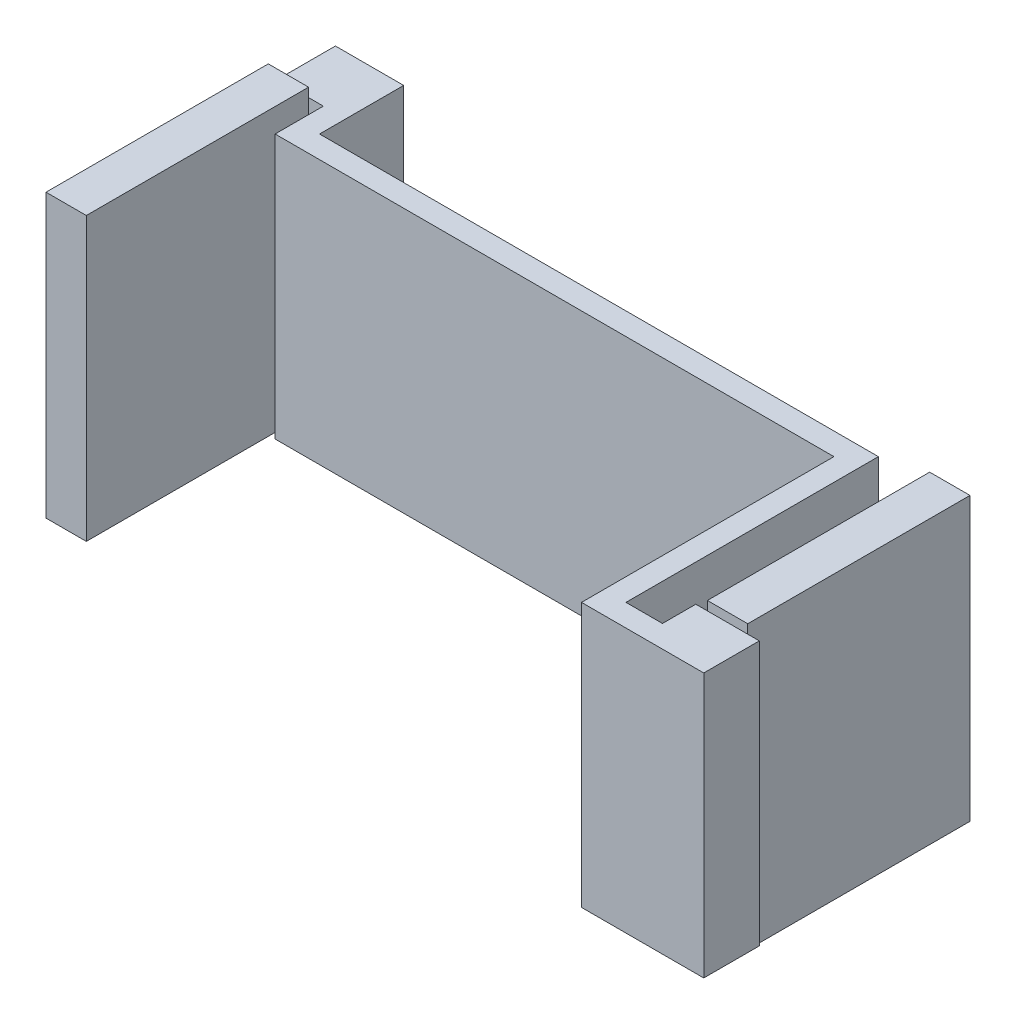
ISO-10303-21;
HEADER;
FILE_DESCRIPTION(('STEP AP214'),'2;1');
FILE_NAME('part.step','',(''),(''),'','','');
FILE_SCHEMA(('AUTOMOTIVE_DESIGN { 1 0 10303 214 1 1 1 1 }'));
ENDSEC;
DATA;
#1=APPLICATION_CONTEXT('core data for automotive mechanical design processes');
#2=APPLICATION_PROTOCOL_DEFINITION('international standard','automotive_design',2000,#1);
#3=PRODUCT_CONTEXT('',#1,'mechanical');
#4=PRODUCT('Part','Part','',(#3));
#5=PRODUCT_RELATED_PRODUCT_CATEGORY('part','',(#4));
#6=PRODUCT_DEFINITION_FORMATION('','',#4);
#7=PRODUCT_DEFINITION_CONTEXT('part definition',#1,'design');
#8=PRODUCT_DEFINITION('design','',#6,#7);
#9=PRODUCT_DEFINITION_SHAPE('','',#8);
#10=(LENGTH_UNIT() NAMED_UNIT(*) SI_UNIT(.MILLI.,.METRE.));
#11=(NAMED_UNIT(*) PLANE_ANGLE_UNIT() SI_UNIT($,.RADIAN.));
#12=(NAMED_UNIT(*) SI_UNIT($,.STERADIAN.) SOLID_ANGLE_UNIT());
#13=UNCERTAINTY_MEASURE_WITH_UNIT(LENGTH_MEASURE(1.E-05),#10,'distance_accuracy_value','');
#14=(GEOMETRIC_REPRESENTATION_CONTEXT(3) GLOBAL_UNCERTAINTY_ASSIGNED_CONTEXT((#13)) GLOBAL_UNIT_ASSIGNED_CONTEXT((#10,
#11,#12)) REPRESENTATION_CONTEXT('',''));
#15=CARTESIAN_POINT('',(0.,0.,0.));
#16=DIRECTION('',(0.,0.,1.));
#17=DIRECTION('',(1.,0.,0.));
#18=AXIS2_PLACEMENT_3D('',#15,#16,#17);
#19=CARTESIAN_POINT('',(54.,53.32,27.6));
#20=DIRECTION('',(1.,0.,0.));
#21=DIRECTION('',(0.,0.,-1.));
#22=AXIS2_PLACEMENT_3D('',#19,#20,#21);
#23=PLANE('',#22);
#24=DIRECTION('',(0.,-1.,0.));
#25=VECTOR('',#24,1.);
#26=CARTESIAN_POINT('',(54.,53.32,26.2));
#27=LINE('',#26,#25);
#28=CARTESIAN_POINT('',(54.,53.32,26.2));
#29=VERTEX_POINT('',#28);
#30=CARTESIAN_POINT('',(54.,36.68,26.2));
#31=VERTEX_POINT('',#30);
#32=EDGE_CURVE('E58',#29,#31,#27,.T.);
#33=ORIENTED_EDGE('',*,*,#32,.F.);
#34=DIRECTION('',(0.,0.,-1.));
#35=VECTOR('',#34,1.);
#36=CARTESIAN_POINT('',(54.,53.32,27.6));
#37=LINE('',#36,#35);
#38=CARTESIAN_POINT('',(54.,53.32,24.1));
#39=VERTEX_POINT('',#38);
#40=EDGE_CURVE('E214',#29,#39,#37,.T.);
#41=ORIENTED_EDGE('',*,*,#40,.T.);
#42=DIRECTION('',(0.,-1.,0.));
#43=VECTOR('',#42,1.);
#44=CARTESIAN_POINT('',(54.,53.32,24.1));
#45=LINE('',#44,#43);
#46=CARTESIAN_POINT('',(54.,36.68,24.1));
#47=VERTEX_POINT('',#46);
#48=EDGE_CURVE('E334',#39,#47,#45,.T.);
#49=ORIENTED_EDGE('',*,*,#48,.T.);
#50=DIRECTION('',(0.,0.,-1.));
#51=VECTOR('',#50,1.);
#52=CARTESIAN_POINT('',(54.,36.68,27.6));
#53=LINE('',#52,#51);
#54=EDGE_CURVE('E356',#31,#47,#53,.T.);
#55=ORIENTED_EDGE('',*,*,#54,.F.);
#56=EDGE_LOOP('',(#33,#41,#49,#55));
#57=FACE_BOUND('',#56,.T.);
#58=ADVANCED_FACE('F39',(#57),#23,.F.);
#59=CARTESIAN_POINT('',(0.,0.,24.1));
#60=DIRECTION('',(0.,0.,1.));
#61=DIRECTION('',(1.,0.,0.));
#62=AXIS2_PLACEMENT_3D('',#59,#60,#61);
#63=PLANE('',#62);
#64=DIRECTION('',(-1.,0.,0.));
#65=VECTOR('',#64,1.);
#66=CARTESIAN_POINT('',(58.,53.32,24.1));
#67=LINE('',#66,#65);
#68=CARTESIAN_POINT('',(57.27,53.32,24.1));
#69=VERTEX_POINT('',#68);
#70=CARTESIAN_POINT('',(54.73,53.32,24.1));
#71=VERTEX_POINT('',#70);
#72=EDGE_CURVE('E11',#69,#71,#67,.T.);
#73=ORIENTED_EDGE('',*,*,#72,.F.);
#74=DIRECTION('',(0.,1.,0.));
#75=VECTOR('',#74,1.);
#76=CARTESIAN_POINT('',(57.27,36.11,24.1));
#77=LINE('',#76,#75);
#78=CARTESIAN_POINT('',(57.27,53.89,24.1));
#79=VERTEX_POINT('',#78);
#80=EDGE_CURVE('E365',#69,#79,#77,.T.);
#81=ORIENTED_EDGE('',*,*,#80,.T.);
#82=DIRECTION('',(-1.,0.,0.));
#83=VECTOR('',#82,1.);
#84=CARTESIAN_POINT('',(57.27,53.89,24.1));
#85=LINE('',#84,#83);
#86=CARTESIAN_POINT('',(54.73,53.89,24.1));
#87=VERTEX_POINT('',#86);
#88=EDGE_CURVE('E368',#79,#87,#85,.T.);
#89=ORIENTED_EDGE('',*,*,#88,.T.);
#90=DIRECTION('',(0.,-1.,0.));
#91=VECTOR('',#90,1.);
#92=CARTESIAN_POINT('',(54.73,53.89,24.1));
#93=LINE('',#92,#91);
#94=EDGE_CURVE('E359',#87,#71,#93,.T.);
#95=ORIENTED_EDGE('',*,*,#94,.T.);
#96=EDGE_LOOP('',(#73,#81,#89,#95));
#97=FACE_BOUND('',#96,.T.);
#98=ADVANCED_FACE('F484',(#97),#63,.T.);
#99=CARTESIAN_POINT('',(54.73,53.89,24.1));
#100=DIRECTION('',(1.,0.,0.));
#101=DIRECTION('',(0.,0.,-1.));
#102=AXIS2_PLACEMENT_3D('',#99,#100,#101);
#103=PLANE('',#102);
#104=DIRECTION('',(0.,-1.,0.));
#105=VECTOR('',#104,1.);
#106=CARTESIAN_POINT('',(54.73,53.89,10.1));
#107=LINE('',#106,#105);
#108=CARTESIAN_POINT('',(54.73,53.89,10.1));
#109=VERTEX_POINT('',#108);
#110=CARTESIAN_POINT('',(54.73,36.11,10.1));
#111=VERTEX_POINT('',#110);
#112=EDGE_CURVE('E358',#109,#111,#107,.T.);
#113=ORIENTED_EDGE('',*,*,#112,.T.);
#114=DIRECTION('',(0.,0.,-1.));
#115=VECTOR('',#114,1.);
#116=CARTESIAN_POINT('',(54.73,36.11,24.1));
#117=LINE('',#116,#115);
#118=CARTESIAN_POINT('',(54.73,36.11,24.1));
#119=VERTEX_POINT('',#118);
#120=EDGE_CURVE('E43',#119,#111,#117,.T.);
#121=ORIENTED_EDGE('',*,*,#120,.F.);
#122=CARTESIAN_POINT('',(54.73,36.68,24.1));
#123=VERTEX_POINT('',#122);
#124=EDGE_CURVE('E363',#123,#119,#93,.T.);
#125=ORIENTED_EDGE('',*,*,#124,.F.);
#126=EDGE_CURVE('E362',#71,#123,#93,.T.);
#127=ORIENTED_EDGE('',*,*,#126,.F.);
#128=ORIENTED_EDGE('',*,*,#94,.F.);
#129=DIRECTION('',(0.,0.,-1.));
#130=VECTOR('',#129,1.);
#131=CARTESIAN_POINT('',(54.73,53.89,24.1));
#132=LINE('',#131,#130);
#133=EDGE_CURVE('E371',#87,#109,#132,.T.);
#134=ORIENTED_EDGE('',*,*,#133,.T.);
#135=EDGE_LOOP('',(#113,#121,#125,#127,#128,#134));
#136=FACE_BOUND('',#135,.T.);
#137=ADVANCED_FACE('F41',(#136),#103,.F.);
#138=CARTESIAN_POINT('',(54.73,36.11,24.1));
#139=DIRECTION('',(0.,1.,0.));
#140=DIRECTION('',(0.,0.,1.));
#141=AXIS2_PLACEMENT_3D('',#138,#139,#140);
#142=PLANE('',#141);
#143=DIRECTION('',(1.,0.,0.));
#144=VECTOR('',#143,1.);
#145=CARTESIAN_POINT('',(54.73,36.11,10.1));
#146=LINE('',#145,#144);
#147=CARTESIAN_POINT('',(57.27,36.11,10.1));
#148=VERTEX_POINT('',#147);
#149=EDGE_CURVE('E374',#111,#148,#146,.T.);
#150=ORIENTED_EDGE('',*,*,#149,.T.);
#151=DIRECTION('',(0.,0.,-1.));
#152=VECTOR('',#151,1.);
#153=CARTESIAN_POINT('',(57.27,36.11,24.1));
#154=LINE('',#153,#152);
#155=CARTESIAN_POINT('',(57.27,36.11,24.1));
#156=VERTEX_POINT('',#155);
#157=EDGE_CURVE('E384',#156,#148,#154,.T.);
#158=ORIENTED_EDGE('',*,*,#157,.F.);
#159=DIRECTION('',(1.,0.,0.));
#160=VECTOR('',#159,1.);
#161=CARTESIAN_POINT('',(54.73,36.11,24.1));
#162=LINE('',#161,#160);
#163=EDGE_CURVE('E361',#119,#156,#162,.T.);
#164=ORIENTED_EDGE('',*,*,#163,.F.);
#165=ORIENTED_EDGE('',*,*,#120,.T.);
#166=EDGE_LOOP('',(#150,#158,#164,#165));
#167=FACE_BOUND('',#166,.T.);
#168=ADVANCED_FACE('F507',(#167),#142,.F.);
#169=CARTESIAN_POINT('',(57.27,36.11,24.1));
#170=DIRECTION('',(-1.,0.,0.));
#171=DIRECTION('',(0.,0.,1.));
#172=AXIS2_PLACEMENT_3D('',#169,#170,#171);
#173=PLANE('',#172);
#174=DIRECTION('',(0.,1.,0.));
#175=VECTOR('',#174,1.);
#176=CARTESIAN_POINT('',(57.27,36.11,10.1));
#177=LINE('',#176,#175);
#178=CARTESIAN_POINT('',(57.27,53.89,10.1));
#179=VERTEX_POINT('',#178);
#180=EDGE_CURVE('E376',#148,#179,#177,.T.);
#181=ORIENTED_EDGE('',*,*,#180,.T.);
#182=DIRECTION('',(0.,0.,-1.));
#183=VECTOR('',#182,1.);
#184=CARTESIAN_POINT('',(57.27,53.89,24.1));
#185=LINE('',#184,#183);
#186=EDGE_CURVE('E382',#79,#179,#185,.T.);
#187=ORIENTED_EDGE('',*,*,#186,.F.);
#188=ORIENTED_EDGE('',*,*,#80,.F.);
#189=CARTESIAN_POINT('',(57.27,36.68,24.1));
#190=VERTEX_POINT('',#189);
#191=EDGE_CURVE('E369',#190,#69,#77,.T.);
#192=ORIENTED_EDGE('',*,*,#191,.F.);
#193=EDGE_CURVE('E366',#156,#190,#77,.T.);
#194=ORIENTED_EDGE('',*,*,#193,.F.);
#195=ORIENTED_EDGE('',*,*,#157,.T.);
#196=EDGE_LOOP('',(#181,#187,#188,#192,#194,#195));
#197=FACE_BOUND('',#196,.T.);
#198=ADVANCED_FACE('F504',(#197),#173,.F.);
#199=CARTESIAN_POINT('',(57.27,53.89,24.1));
#200=DIRECTION('',(0.,-1.,0.));
#201=DIRECTION('',(0.,0.,-1.));
#202=AXIS2_PLACEMENT_3D('',#199,#200,#201);
#203=PLANE('',#202);
#204=DIRECTION('',(-1.,0.,0.));
#205=VECTOR('',#204,1.);
#206=CARTESIAN_POINT('',(57.27,53.89,10.1));
#207=LINE('',#206,#205);
#208=EDGE_CURVE('E378',#179,#109,#207,.T.);
#209=ORIENTED_EDGE('',*,*,#208,.T.);
#210=ORIENTED_EDGE('',*,*,#133,.F.);
#211=ORIENTED_EDGE('',*,*,#88,.F.);
#212=ORIENTED_EDGE('',*,*,#186,.T.);
#213=EDGE_LOOP('',(#209,#210,#211,#212));
#214=FACE_BOUND('',#213,.T.);
#215=ADVANCED_FACE('F496',(#214),#203,.F.);
#216=DIRECTION('',(1.,0.,0.));
#217=VECTOR('',#216,1.);
#218=CARTESIAN_POINT('',(54.,36.68,24.1));
#219=LINE('',#218,#217);
#220=EDGE_CURVE('E48',#123,#190,#219,.T.);
#221=ORIENTED_EDGE('',*,*,#220,.F.);
#222=ORIENTED_EDGE('',*,*,#124,.T.);
#223=ORIENTED_EDGE('',*,*,#163,.T.);
#224=ORIENTED_EDGE('',*,*,#193,.T.);
#225=EDGE_LOOP('',(#221,#222,#223,#224));
#226=FACE_BOUND('',#225,.T.);
#227=ADVANCED_FACE('F490',(#226),#63,.T.);
#228=CARTESIAN_POINT('',(0.,0.,10.1));
#229=DIRECTION('',(0.,0.,1.));
#230=DIRECTION('',(1.,0.,0.));
#231=AXIS2_PLACEMENT_3D('',#228,#229,#230);
#232=PLANE('',#231);
#233=ORIENTED_EDGE('',*,*,#112,.F.);
#234=ORIENTED_EDGE('',*,*,#208,.F.);
#235=ORIENTED_EDGE('',*,*,#180,.F.);
#236=ORIENTED_EDGE('',*,*,#149,.F.);
#237=EDGE_LOOP('',(#233,#234,#235,#236));
#238=FACE_BOUND('',#237,.T.);
#239=ADVANCED_FACE('F495',(#238),#232,.F.);
#240=CARTESIAN_POINT('',(0.,0.,24.1));
#241=DIRECTION('',(0.,0.,1.));
#242=DIRECTION('',(1.,0.,0.));
#243=AXIS2_PLACEMENT_3D('',#240,#241,#242);
#244=PLANE('',#243);
#245=EDGE_CURVE('E51',#71,#39,#67,.T.);
#246=ORIENTED_EDGE('',*,*,#245,.F.);
#247=ORIENTED_EDGE('',*,*,#126,.T.);
#248=EDGE_CURVE('E344',#47,#123,#219,.T.);
#249=ORIENTED_EDGE('',*,*,#248,.F.);
#250=ORIENTED_EDGE('',*,*,#48,.F.);
#251=EDGE_LOOP('',(#246,#247,#249,#250));
#252=FACE_BOUND('',#251,.T.);
#253=ADVANCED_FACE('F500',(#252),#244,.F.);
#254=CARTESIAN_POINT('',(58.,36.68,24.1));
#255=VERTEX_POINT('',#254);
#256=EDGE_CURVE('E343',#190,#255,#219,.T.);
#257=ORIENTED_EDGE('',*,*,#256,.F.);
#258=ORIENTED_EDGE('',*,*,#191,.T.);
#259=CARTESIAN_POINT('',(58.,53.32,24.1));
#260=VERTEX_POINT('',#259);
#261=EDGE_CURVE('E50',#260,#69,#67,.T.);
#262=ORIENTED_EDGE('',*,*,#261,.F.);
#263=DIRECTION('',(0.,1.,0.));
#264=VECTOR('',#263,1.);
#265=CARTESIAN_POINT('',(58.,36.68,24.1));
#266=LINE('',#265,#264);
#267=EDGE_CURVE('E347',#255,#260,#266,.T.);
#268=ORIENTED_EDGE('',*,*,#267,.F.);
#269=EDGE_LOOP('',(#257,#258,#262,#268));
#270=FACE_BOUND('',#269,.T.);
#271=ADVANCED_FACE('F405',(#270),#244,.F.);
#272=CARTESIAN_POINT('',(54.,36.68,27.6));
#273=DIRECTION('',(0.,1.,0.));
#274=DIRECTION('',(0.,0.,1.));
#275=AXIS2_PLACEMENT_3D('',#272,#273,#274);
#276=PLANE('',#275);
#277=DIRECTION('',(1.,0.,0.));
#278=VECTOR('',#277,1.);
#279=CARTESIAN_POINT('',(54.,36.68,27.6));
#280=LINE('',#279,#278);
#281=CARTESIAN_POINT('',(50.3,36.68,27.6));
#282=VERTEX_POINT('',#281);
#283=CARTESIAN_POINT('',(58.,36.68,27.6));
#284=VERTEX_POINT('',#283);
#285=EDGE_CURVE('E335',#282,#284,#280,.T.);
#286=ORIENTED_EDGE('',*,*,#285,.F.);
#287=DIRECTION('',(0.,0.,-1.));
#288=VECTOR('',#287,1.);
#289=CARTESIAN_POINT('',(50.3,36.68,27.6));
#290=LINE('',#289,#288);
#291=CARTESIAN_POINT('',(50.3,36.68,11.7));
#292=VERTEX_POINT('',#291);
#293=EDGE_CURVE('E240',#282,#292,#290,.T.);
#294=ORIENTED_EDGE('',*,*,#293,.T.);
#295=DIRECTION('',(1.,0.,0.));
#296=VECTOR('',#295,1.);
#297=CARTESIAN_POINT('',(15.1,36.68,11.7));
#298=LINE('',#297,#296);
#299=CARTESIAN_POINT('',(15.1,36.68,11.7));
#300=VERTEX_POINT('',#299);
#301=EDGE_CURVE('E257',#300,#292,#298,.T.);
#302=ORIENTED_EDGE('',*,*,#301,.F.);
#303=DIRECTION('',(0.,0.,-1.));
#304=VECTOR('',#303,1.);
#305=CARTESIAN_POINT('',(15.1,36.68,11.7));
#306=LINE('',#305,#304);
#307=CARTESIAN_POINT('',(15.1,36.68,8.66));
#308=VERTEX_POINT('',#307);
#309=EDGE_CURVE('E264',#300,#308,#306,.T.);
#310=ORIENTED_EDGE('',*,*,#309,.T.);
#311=DIRECTION('',(1.,0.,0.));
#312=VECTOR('',#311,1.);
#313=CARTESIAN_POINT('',(12.2,36.68,8.66));
#314=LINE('',#313,#312);
#315=CARTESIAN_POINT('',(14.17,36.68,8.66));
#316=VERTEX_POINT('',#315);
#317=EDGE_CURVE('E273',#316,#308,#314,.T.);
#318=ORIENTED_EDGE('',*,*,#317,.F.);
#319=CARTESIAN_POINT('',(12.2,36.68,8.66));
#320=VERTEX_POINT('',#319);
#321=EDGE_CURVE('E275',#320,#316,#314,.T.);
#322=ORIENTED_EDGE('',*,*,#321,.F.);
#323=DIRECTION('',(0.,0.,-1.));
#324=VECTOR('',#323,1.);
#325=CARTESIAN_POINT('',(12.2,36.68,8.66));
#326=LINE('',#325,#324);
#327=CARTESIAN_POINT('',(12.2,36.68,5.));
#328=VERTEX_POINT('',#327);
#329=EDGE_CURVE('E297',#320,#328,#326,.T.);
#330=ORIENTED_EDGE('',*,*,#329,.T.);
#331=DIRECTION('',(1.,0.,0.));
#332=VECTOR('',#331,1.);
#333=CARTESIAN_POINT('',(12.2,36.68,5.));
#334=LINE('',#333,#332);
#335=CARTESIAN_POINT('',(16.5,36.68,5.));
#336=VERTEX_POINT('',#335);
#337=EDGE_CURVE('E284',#328,#336,#334,.T.);
#338=ORIENTED_EDGE('',*,*,#337,.T.);
#339=DIRECTION('',(0.,0.,-1.));
#340=VECTOR('',#339,1.);
#341=CARTESIAN_POINT('',(16.5,36.68,8.66));
#342=LINE('',#341,#340);
#343=CARTESIAN_POINT('',(16.5,36.68,10.3));
#344=VERTEX_POINT('',#343);
#345=EDGE_CURVE('E295',#344,#336,#342,.T.);
#346=ORIENTED_EDGE('',*,*,#345,.F.);
#347=DIRECTION('',(1.,0.,0.));
#348=VECTOR('',#347,1.);
#349=CARTESIAN_POINT('',(15.1,36.68,10.3));
#350=LINE('',#349,#348);
#351=CARTESIAN_POINT('',(51.7,36.68,10.3));
#352=VERTEX_POINT('',#351);
#353=EDGE_CURVE('E245',#344,#352,#350,.T.);
#354=ORIENTED_EDGE('',*,*,#353,.T.);
#355=DIRECTION('',(0.,0.,-1.));
#356=VECTOR('',#355,1.);
#357=CARTESIAN_POINT('',(51.7,36.68,11.7));
#358=LINE('',#357,#356);
#359=CARTESIAN_POINT('',(51.7,36.68,26.2));
#360=VERTEX_POINT('',#359);
#361=EDGE_CURVE('E226',#360,#352,#358,.T.);
#362=ORIENTED_EDGE('',*,*,#361,.F.);
#363=DIRECTION('',(1.,0.,0.));
#364=VECTOR('',#363,1.);
#365=CARTESIAN_POINT('',(50.3,36.68,26.2));
#366=LINE('',#365,#364);
#367=EDGE_CURVE('E218',#360,#31,#366,.T.);
#368=ORIENTED_EDGE('',*,*,#367,.T.);
#369=ORIENTED_EDGE('',*,*,#54,.T.);
#370=ORIENTED_EDGE('',*,*,#248,.T.);
#371=ORIENTED_EDGE('',*,*,#220,.T.);
#372=ORIENTED_EDGE('',*,*,#256,.T.);
#373=DIRECTION('',(0.,0.,-1.));
#374=VECTOR('',#373,1.);
#375=CARTESIAN_POINT('',(58.,36.68,27.6));
#376=LINE('',#375,#374);
#377=EDGE_CURVE('E354',#284,#255,#376,.T.);
#378=ORIENTED_EDGE('',*,*,#377,.F.);
#379=EDGE_LOOP('',(#286,#294,#302,#310,#318,#322,#330,#338,#346,#354,#362,#368,#369,#370,#371,
#372,#378));
#380=FACE_BOUND('',#379,.T.);
#381=ADVANCED_FACE('F400',(#380),#276,.F.);
#382=CARTESIAN_POINT('',(58.,36.68,27.6));
#383=DIRECTION('',(-1.,0.,0.));
#384=DIRECTION('',(0.,0.,1.));
#385=AXIS2_PLACEMENT_3D('',#382,#383,#384);
#386=PLANE('',#385);
#387=ORIENTED_EDGE('',*,*,#377,.T.);
#388=ORIENTED_EDGE('',*,*,#267,.T.);
#389=DIRECTION('',(0.,0.,-1.));
#390=VECTOR('',#389,1.);
#391=CARTESIAN_POINT('',(58.,53.32,27.6));
#392=LINE('',#391,#390);
#393=CARTESIAN_POINT('',(58.,53.32,27.6));
#394=VERTEX_POINT('',#393);
#395=EDGE_CURVE('E352',#394,#260,#392,.T.);
#396=ORIENTED_EDGE('',*,*,#395,.F.);
#397=DIRECTION('',(0.,1.,0.));
#398=VECTOR('',#397,1.);
#399=CARTESIAN_POINT('',(58.,36.68,27.6));
#400=LINE('',#399,#398);
#401=EDGE_CURVE('E337',#284,#394,#400,.T.);
#402=ORIENTED_EDGE('',*,*,#401,.F.);
#403=EDGE_LOOP('',(#387,#388,#396,#402));
#404=FACE_BOUND('',#403,.T.);
#405=ADVANCED_FACE('F408',(#404),#386,.F.);
#406=CARTESIAN_POINT('',(58.,53.32,27.6));
#407=DIRECTION('',(0.,-1.,0.));
#408=DIRECTION('',(0.,0.,-1.));
#409=AXIS2_PLACEMENT_3D('',#406,#407,#408);
#410=PLANE('',#409);
#411=ORIENTED_EDGE('',*,*,#395,.T.);
#412=ORIENTED_EDGE('',*,*,#261,.T.);
#413=ORIENTED_EDGE('',*,*,#72,.T.);
#414=ORIENTED_EDGE('',*,*,#245,.T.);
#415=ORIENTED_EDGE('',*,*,#40,.F.);
#416=DIRECTION('',(-1.,0.,0.));
#417=VECTOR('',#416,1.);
#418=CARTESIAN_POINT('',(58.,53.32,26.2));
#419=LINE('',#418,#417);
#420=CARTESIAN_POINT('',(51.7,53.32,26.2));
#421=VERTEX_POINT('',#420);
#422=EDGE_CURVE('E208',#29,#421,#419,.T.);
#423=ORIENTED_EDGE('',*,*,#422,.T.);
#424=DIRECTION('',(0.,0.,-1.));
#425=VECTOR('',#424,1.);
#426=CARTESIAN_POINT('',(51.7,53.32,11.7));
#427=LINE('',#426,#425);
#428=CARTESIAN_POINT('',(51.7,53.32,10.3));
#429=VERTEX_POINT('',#428);
#430=EDGE_CURVE('E211',#421,#429,#427,.T.);
#431=ORIENTED_EDGE('',*,*,#430,.T.);
#432=DIRECTION('',(-1.,0.,0.));
#433=VECTOR('',#432,1.);
#434=CARTESIAN_POINT('',(51.7,53.32,10.3));
#435=LINE('',#434,#433);
#436=CARTESIAN_POINT('',(16.5,53.32,10.3));
#437=VERTEX_POINT('',#436);
#438=EDGE_CURVE('E227',#429,#437,#435,.T.);
#439=ORIENTED_EDGE('',*,*,#438,.T.);
#440=DIRECTION('',(0.,0.,-1.));
#441=VECTOR('',#440,1.);
#442=CARTESIAN_POINT('',(16.5,53.32,8.66));
#443=LINE('',#442,#441);
#444=CARTESIAN_POINT('',(16.5,53.32,5.));
#445=VERTEX_POINT('',#444);
#446=EDGE_CURVE('E293',#437,#445,#443,.T.);
#447=ORIENTED_EDGE('',*,*,#446,.T.);
#448=DIRECTION('',(-1.,0.,0.));
#449=VECTOR('',#448,1.);
#450=CARTESIAN_POINT('',(16.5,53.32,5.));
#451=LINE('',#450,#449);
#452=CARTESIAN_POINT('',(12.2,53.32,5.));
#453=VERTEX_POINT('',#452);
#454=EDGE_CURVE('E274',#445,#453,#451,.T.);
#455=ORIENTED_EDGE('',*,*,#454,.T.);
#456=DIRECTION('',(0.,0.,-1.));
#457=VECTOR('',#456,1.);
#458=CARTESIAN_POINT('',(12.2,53.32,8.66));
#459=LINE('',#458,#457);
#460=CARTESIAN_POINT('',(12.2,53.32,8.66));
#461=VERTEX_POINT('',#460);
#462=EDGE_CURVE('E280',#461,#453,#459,.T.);
#463=ORIENTED_EDGE('',*,*,#462,.F.);
#464=DIRECTION('',(-1.,0.,0.));
#465=VECTOR('',#464,1.);
#466=CARTESIAN_POINT('',(16.5,53.32,8.66));
#467=LINE('',#466,#465);
#468=CARTESIAN_POINT('',(14.17,53.32,8.66));
#469=VERTEX_POINT('',#468);
#470=EDGE_CURVE('E281',#469,#461,#467,.T.);
#471=ORIENTED_EDGE('',*,*,#470,.F.);
#472=CARTESIAN_POINT('',(15.1,53.32,8.66));
#473=VERTEX_POINT('',#472);
#474=EDGE_CURVE('E278',#473,#469,#467,.T.);
#475=ORIENTED_EDGE('',*,*,#474,.F.);
#476=DIRECTION('',(0.,0.,-1.));
#477=VECTOR('',#476,1.);
#478=CARTESIAN_POINT('',(15.1,53.32,11.7));
#479=LINE('',#478,#477);
#480=CARTESIAN_POINT('',(15.1,53.32,11.7));
#481=VERTEX_POINT('',#480);
#482=EDGE_CURVE('E262',#481,#473,#479,.T.);
#483=ORIENTED_EDGE('',*,*,#482,.F.);
#484=DIRECTION('',(-1.,0.,0.));
#485=VECTOR('',#484,1.);
#486=CARTESIAN_POINT('',(16.5,53.32,11.7));
#487=LINE('',#486,#485);
#488=CARTESIAN_POINT('',(50.3,53.32,11.7));
#489=VERTEX_POINT('',#488);
#490=EDGE_CURVE('E260',#489,#481,#487,.T.);
#491=ORIENTED_EDGE('',*,*,#490,.F.);
#492=DIRECTION('',(0.,0.,-1.));
#493=VECTOR('',#492,1.);
#494=CARTESIAN_POINT('',(50.3,53.32,27.6));
#495=LINE('',#494,#493);
#496=CARTESIAN_POINT('',(50.3,53.32,27.6));
#497=VERTEX_POINT('',#496);
#498=EDGE_CURVE('E235',#497,#489,#495,.T.);
#499=ORIENTED_EDGE('',*,*,#498,.F.);
#500=DIRECTION('',(-1.,0.,0.));
#501=VECTOR('',#500,1.);
#502=CARTESIAN_POINT('',(58.,53.32,27.6));
#503=LINE('',#502,#501);
#504=EDGE_CURVE('E339',#394,#497,#503,.T.);
#505=ORIENTED_EDGE('',*,*,#504,.F.);
#506=EDGE_LOOP('',(#411,#412,#413,#414,#415,#423,#431,#439,#447,#455,#463,#471,#475,#483,#491,
#499,#505));
#507=FACE_BOUND('',#506,.T.);
#508=ADVANCED_FACE('F210',(#507),#410,.F.);
#509=CARTESIAN_POINT('',(0.,0.,27.6));
#510=DIRECTION('',(0.,0.,1.));
#511=DIRECTION('',(1.,0.,0.));
#512=AXIS2_PLACEMENT_3D('',#509,#510,#511);
#513=PLANE('',#512);
#514=ORIENTED_EDGE('',*,*,#504,.T.);
#515=DIRECTION('',(0.,-1.,0.));
#516=VECTOR('',#515,1.);
#517=CARTESIAN_POINT('',(50.3,53.32,27.6));
#518=LINE('',#517,#516);
#519=EDGE_CURVE('E232',#497,#282,#518,.T.);
#520=ORIENTED_EDGE('',*,*,#519,.T.);
#521=ORIENTED_EDGE('',*,*,#285,.T.);
#522=ORIENTED_EDGE('',*,*,#401,.T.);
#523=EDGE_LOOP('',(#514,#520,#521,#522));
#524=FACE_BOUND('',#523,.T.);
#525=ADVANCED_FACE('F411',(#524),#513,.T.);
#526=CARTESIAN_POINT('',(0.,0.,26.2));
#527=DIRECTION('',(0.,0.,1.));
#528=DIRECTION('',(1.,0.,0.));
#529=AXIS2_PLACEMENT_3D('',#526,#527,#528);
#530=PLANE('',#529);
#531=ORIENTED_EDGE('',*,*,#422,.F.);
#532=ORIENTED_EDGE('',*,*,#32,.T.);
#533=ORIENTED_EDGE('',*,*,#367,.F.);
#534=DIRECTION('',(0.,1.,0.));
#535=VECTOR('',#534,1.);
#536=CARTESIAN_POINT('',(51.7,36.68,26.2));
#537=LINE('',#536,#535);
#538=EDGE_CURVE('E217',#360,#421,#537,.T.);
#539=ORIENTED_EDGE('',*,*,#538,.T.);
#540=EDGE_LOOP('',(#531,#532,#533,#539));
#541=FACE_BOUND('',#540,.T.);
#542=ADVANCED_FACE('F230',(#541),#530,.F.);
#543=CARTESIAN_POINT('',(51.7,36.68,11.7));
#544=DIRECTION('',(-1.,0.,0.));
#545=DIRECTION('',(0.,0.,1.));
#546=AXIS2_PLACEMENT_3D('',#543,#544,#545);
#547=PLANE('',#546);
#548=ORIENTED_EDGE('',*,*,#538,.F.);
#549=ORIENTED_EDGE('',*,*,#361,.T.);
#550=DIRECTION('',(0.,1.,0.));
#551=VECTOR('',#550,1.);
#552=CARTESIAN_POINT('',(51.7,36.68,10.3));
#553=LINE('',#552,#551);
#554=EDGE_CURVE('E224',#352,#429,#553,.T.);
#555=ORIENTED_EDGE('',*,*,#554,.T.);
#556=ORIENTED_EDGE('',*,*,#430,.F.);
#557=EDGE_LOOP('',(#548,#549,#555,#556));
#558=FACE_BOUND('',#557,.T.);
#559=ADVANCED_FACE('F221',(#558),#547,.F.);
#560=CARTESIAN_POINT('',(0.,0.,11.7));
#561=DIRECTION('',(0.,0.,1.));
#562=DIRECTION('',(1.,0.,0.));
#563=AXIS2_PLACEMENT_3D('',#560,#561,#562);
#564=PLANE('',#563);
#565=ORIENTED_EDGE('',*,*,#301,.T.);
#566=DIRECTION('',(0.,1.,0.));
#567=VECTOR('',#566,1.);
#568=CARTESIAN_POINT('',(50.3,0.,11.7));
#569=LINE('',#568,#567);
#570=EDGE_CURVE('E242',#292,#489,#569,.T.);
#571=ORIENTED_EDGE('',*,*,#570,.T.);
#572=ORIENTED_EDGE('',*,*,#490,.T.);
#573=DIRECTION('',(0.,-1.,0.));
#574=VECTOR('',#573,1.);
#575=CARTESIAN_POINT('',(15.1,53.32,11.7));
#576=LINE('',#575,#574);
#577=EDGE_CURVE('E254',#481,#300,#576,.T.);
#578=ORIENTED_EDGE('',*,*,#577,.T.);
#579=EDGE_LOOP('',(#565,#571,#572,#578));
#580=FACE_BOUND('',#579,.T.);
#581=ADVANCED_FACE('F418',(#580),#564,.T.);
#582=CARTESIAN_POINT('',(16.5,36.68,8.66));
#583=DIRECTION('',(-1.,0.,0.));
#584=DIRECTION('',(0.,0.,1.));
#585=AXIS2_PLACEMENT_3D('',#582,#583,#584);
#586=PLANE('',#585);
#587=DIRECTION('',(0.,1.,0.));
#588=VECTOR('',#587,1.);
#589=CARTESIAN_POINT('',(16.5,36.68,10.3));
#590=LINE('',#589,#588);
#591=EDGE_CURVE('E251',#344,#437,#590,.T.);
#592=ORIENTED_EDGE('',*,*,#591,.F.);
#593=ORIENTED_EDGE('',*,*,#345,.T.);
#594=DIRECTION('',(0.,1.,0.));
#595=VECTOR('',#594,1.);
#596=CARTESIAN_POINT('',(16.5,36.68,5.));
#597=LINE('',#596,#595);
#598=EDGE_CURVE('E287',#336,#445,#597,.T.);
#599=ORIENTED_EDGE('',*,*,#598,.T.);
#600=ORIENTED_EDGE('',*,*,#446,.F.);
#601=EDGE_LOOP('',(#592,#593,#599,#600));
#602=FACE_BOUND('',#601,.T.);
#603=ADVANCED_FACE('F472',(#602),#586,.F.);
#604=CARTESIAN_POINT('',(0.,0.,8.66));
#605=DIRECTION('',(0.,0.,1.));
#606=DIRECTION('',(1.,0.,0.));
#607=AXIS2_PLACEMENT_3D('',#604,#605,#606);
#608=PLANE('',#607);
#609=ORIENTED_EDGE('',*,*,#317,.T.);
#610=DIRECTION('',(0.,1.,0.));
#611=VECTOR('',#610,1.);
#612=CARTESIAN_POINT('',(15.1,0.,8.66));
#613=LINE('',#612,#611);
#614=EDGE_CURVE('E266',#308,#473,#613,.T.);
#615=ORIENTED_EDGE('',*,*,#614,.T.);
#616=ORIENTED_EDGE('',*,*,#474,.T.);
#617=DIRECTION('',(0.,1.,0.));
#618=VECTOR('',#617,1.);
#619=CARTESIAN_POINT('',(14.17,36.11,8.66));
#620=LINE('',#619,#618);
#621=EDGE_CURVE('E320',#316,#469,#620,.T.);
#622=ORIENTED_EDGE('',*,*,#621,.F.);
#623=EDGE_LOOP('',(#609,#615,#616,#622));
#624=FACE_BOUND('',#623,.T.);
#625=ADVANCED_FACE('F432',(#624),#608,.T.);
#626=CARTESIAN_POINT('',(11.63,53.89,22.66));
#627=DIRECTION('',(1.,0.,0.));
#628=DIRECTION('',(0.,0.,-1.));
#629=AXIS2_PLACEMENT_3D('',#626,#627,#628);
#630=PLANE('',#629);
#631=DIRECTION('',(0.,-1.,0.));
#632=VECTOR('',#631,1.);
#633=CARTESIAN_POINT('',(11.63,53.89,8.66));
#634=LINE('',#633,#632);
#635=CARTESIAN_POINT('',(11.63,53.89,8.66));
#636=VERTEX_POINT('',#635);
#637=CARTESIAN_POINT('',(11.63,36.11,8.66));
#638=VERTEX_POINT('',#637);
#639=EDGE_CURVE('E300',#636,#638,#634,.T.);
#640=ORIENTED_EDGE('',*,*,#639,.T.);
#641=DIRECTION('',(0.,0.,-1.));
#642=VECTOR('',#641,1.);
#643=CARTESIAN_POINT('',(11.63,36.11,22.66));
#644=LINE('',#643,#642);
#645=CARTESIAN_POINT('',(11.63,36.11,22.66));
#646=VERTEX_POINT('',#645);
#647=EDGE_CURVE('E330',#646,#638,#644,.T.);
#648=ORIENTED_EDGE('',*,*,#647,.F.);
#649=DIRECTION('',(0.,-1.,0.));
#650=VECTOR('',#649,1.);
#651=CARTESIAN_POINT('',(11.63,53.89,22.66));
#652=LINE('',#651,#650);
#653=CARTESIAN_POINT('',(11.63,53.89,22.66));
#654=VERTEX_POINT('',#653);
#655=EDGE_CURVE('E301',#654,#646,#652,.T.);
#656=ORIENTED_EDGE('',*,*,#655,.F.);
#657=DIRECTION('',(0.,0.,-1.));
#658=VECTOR('',#657,1.);
#659=CARTESIAN_POINT('',(11.63,53.89,22.66));
#660=LINE('',#659,#658);
#661=EDGE_CURVE('E311',#654,#636,#660,.T.);
#662=ORIENTED_EDGE('',*,*,#661,.T.);
#663=EDGE_LOOP('',(#640,#648,#656,#662));
#664=FACE_BOUND('',#663,.T.);
#665=ADVANCED_FACE('F451',(#664),#630,.F.);
#666=CARTESIAN_POINT('',(11.63,36.11,22.66));
#667=DIRECTION('',(0.,1.,0.));
#668=DIRECTION('',(0.,0.,1.));
#669=AXIS2_PLACEMENT_3D('',#666,#667,#668);
#670=PLANE('',#669);
#671=DIRECTION('',(1.,0.,0.));
#672=VECTOR('',#671,1.);
#673=CARTESIAN_POINT('',(11.63,36.11,8.66));
#674=LINE('',#673,#672);
#675=CARTESIAN_POINT('',(14.17,36.11,8.66));
#676=VERTEX_POINT('',#675);
#677=EDGE_CURVE('E314',#638,#676,#674,.T.);
#678=ORIENTED_EDGE('',*,*,#677,.T.);
#679=DIRECTION('',(0.,0.,-1.));
#680=VECTOR('',#679,1.);
#681=CARTESIAN_POINT('',(14.17,36.11,22.66));
#682=LINE('',#681,#680);
#683=CARTESIAN_POINT('',(14.17,36.11,22.66));
#684=VERTEX_POINT('',#683);
#685=EDGE_CURVE('E327',#684,#676,#682,.T.);
#686=ORIENTED_EDGE('',*,*,#685,.F.);
#687=DIRECTION('',(1.,0.,0.));
#688=VECTOR('',#687,1.);
#689=CARTESIAN_POINT('',(11.63,36.11,22.66));
#690=LINE('',#689,#688);
#691=EDGE_CURVE('E304',#646,#684,#690,.T.);
#692=ORIENTED_EDGE('',*,*,#691,.F.);
#693=ORIENTED_EDGE('',*,*,#647,.T.);
#694=EDGE_LOOP('',(#678,#686,#692,#693));
#695=FACE_BOUND('',#694,.T.);
#696=ADVANCED_FACE('F662',(#695),#670,.F.);
#697=CARTESIAN_POINT('',(14.17,36.11,22.66));
#698=DIRECTION('',(-1.,0.,0.));
#699=DIRECTION('',(0.,0.,1.));
#700=AXIS2_PLACEMENT_3D('',#697,#698,#699);
#701=PLANE('',#700);
#702=EDGE_CURVE('E317',#676,#316,#620,.T.);
#703=ORIENTED_EDGE('',*,*,#702,.T.);
#704=ORIENTED_EDGE('',*,*,#621,.T.);
#705=CARTESIAN_POINT('',(14.17,53.89,8.66));
#706=VERTEX_POINT('',#705);
#707=EDGE_CURVE('E316',#469,#706,#620,.T.);
#708=ORIENTED_EDGE('',*,*,#707,.T.);
#709=DIRECTION('',(0.,0.,-1.));
#710=VECTOR('',#709,1.);
#711=CARTESIAN_POINT('',(14.17,53.89,22.66));
#712=LINE('',#711,#710);
#713=CARTESIAN_POINT('',(14.17,53.89,22.66));
#714=VERTEX_POINT('',#713);
#715=EDGE_CURVE('E324',#714,#706,#712,.T.);
#716=ORIENTED_EDGE('',*,*,#715,.F.);
#717=DIRECTION('',(0.,1.,0.));
#718=VECTOR('',#717,1.);
#719=CARTESIAN_POINT('',(14.17,36.11,22.66));
#720=LINE('',#719,#718);
#721=EDGE_CURVE('E307',#684,#714,#720,.T.);
#722=ORIENTED_EDGE('',*,*,#721,.F.);
#723=ORIENTED_EDGE('',*,*,#685,.T.);
#724=EDGE_LOOP('',(#703,#704,#708,#716,#722,#723));
#725=FACE_BOUND('',#724,.T.);
#726=ADVANCED_FACE('F437',(#725),#701,.F.);
#727=CARTESIAN_POINT('',(14.17,53.89,22.66));
#728=DIRECTION('',(0.,-1.,0.));
#729=DIRECTION('',(0.,0.,-1.));
#730=AXIS2_PLACEMENT_3D('',#727,#728,#729);
#731=PLANE('',#730);
#732=DIRECTION('',(-1.,0.,0.));
#733=VECTOR('',#732,1.);
#734=CARTESIAN_POINT('',(14.17,53.89,8.66));
#735=LINE('',#734,#733);
#736=EDGE_CURVE('E305',#706,#636,#735,.T.);
#737=ORIENTED_EDGE('',*,*,#736,.T.);
#738=ORIENTED_EDGE('',*,*,#661,.F.);
#739=DIRECTION('',(-1.,0.,0.));
#740=VECTOR('',#739,1.);
#741=CARTESIAN_POINT('',(14.17,53.89,22.66));
#742=LINE('',#741,#740);
#743=EDGE_CURVE('E309',#714,#654,#742,.T.);
#744=ORIENTED_EDGE('',*,*,#743,.F.);
#745=ORIENTED_EDGE('',*,*,#715,.T.);
#746=EDGE_LOOP('',(#737,#738,#744,#745));
#747=FACE_BOUND('',#746,.T.);
#748=ADVANCED_FACE('F444',(#747),#731,.F.);
#749=CARTESIAN_POINT('',(0.,0.,22.66));
#750=DIRECTION('',(0.,0.,1.));
#751=DIRECTION('',(1.,0.,0.));
#752=AXIS2_PLACEMENT_3D('',#749,#750,#751);
#753=PLANE('',#752);
#754=ORIENTED_EDGE('',*,*,#655,.T.);
#755=ORIENTED_EDGE('',*,*,#691,.T.);
#756=ORIENTED_EDGE('',*,*,#721,.T.);
#757=ORIENTED_EDGE('',*,*,#743,.T.);
#758=EDGE_LOOP('',(#754,#755,#756,#757));
#759=FACE_BOUND('',#758,.T.);
#760=ADVANCED_FACE('F454',(#759),#753,.T.);
#761=CARTESIAN_POINT('',(0.,0.,8.66));
#762=DIRECTION('',(0.,0.,1.));
#763=DIRECTION('',(1.,0.,0.));
#764=AXIS2_PLACEMENT_3D('',#761,#762,#763);
#765=PLANE('',#764);
#766=DIRECTION('',(0.,-1.,0.));
#767=VECTOR('',#766,1.);
#768=CARTESIAN_POINT('',(12.2,53.32,8.66));
#769=LINE('',#768,#767);
#770=EDGE_CURVE('E270',#461,#320,#769,.T.);
#771=ORIENTED_EDGE('',*,*,#770,.T.);
#772=ORIENTED_EDGE('',*,*,#321,.T.);
#773=ORIENTED_EDGE('',*,*,#702,.F.);
#774=ORIENTED_EDGE('',*,*,#677,.F.);
#775=ORIENTED_EDGE('',*,*,#639,.F.);
#776=ORIENTED_EDGE('',*,*,#736,.F.);
#777=ORIENTED_EDGE('',*,*,#707,.F.);
#778=ORIENTED_EDGE('',*,*,#470,.T.);
#779=EDGE_LOOP('',(#771,#772,#773,#774,#775,#776,#777,#778));
#780=FACE_BOUND('',#779,.T.);
#781=ADVANCED_FACE('F447',(#780),#765,.F.);
#782=CARTESIAN_POINT('',(12.2,53.32,8.66));
#783=DIRECTION('',(1.,0.,0.));
#784=DIRECTION('',(0.,0.,-1.));
#785=AXIS2_PLACEMENT_3D('',#782,#783,#784);
#786=PLANE('',#785);
#787=DIRECTION('',(0.,-1.,0.));
#788=VECTOR('',#787,1.);
#789=CARTESIAN_POINT('',(12.2,53.32,5.));
#790=LINE('',#789,#788);
#791=EDGE_CURVE('E269',#453,#328,#790,.T.);
#792=ORIENTED_EDGE('',*,*,#791,.T.);
#793=ORIENTED_EDGE('',*,*,#329,.F.);
#794=ORIENTED_EDGE('',*,*,#770,.F.);
#795=ORIENTED_EDGE('',*,*,#462,.T.);
#796=EDGE_LOOP('',(#792,#793,#794,#795));
#797=FACE_BOUND('',#796,.T.);
#798=ADVANCED_FACE('F459',(#797),#786,.F.);
#799=CARTESIAN_POINT('',(0.,0.,5.));
#800=DIRECTION('',(0.,0.,1.));
#801=DIRECTION('',(1.,0.,0.));
#802=AXIS2_PLACEMENT_3D('',#799,#800,#801);
#803=PLANE('',#802);
#804=ORIENTED_EDGE('',*,*,#598,.F.);
#805=ORIENTED_EDGE('',*,*,#337,.F.);
#806=ORIENTED_EDGE('',*,*,#791,.F.);
#807=ORIENTED_EDGE('',*,*,#454,.F.);
#808=EDGE_LOOP('',(#804,#805,#806,#807));
#809=FACE_BOUND('',#808,.T.);
#810=ADVANCED_FACE('F465',(#809),#803,.F.);
#811=CARTESIAN_POINT('',(15.1,53.32,11.7));
#812=DIRECTION('',(1.,0.,0.));
#813=DIRECTION('',(0.,0.,-1.));
#814=AXIS2_PLACEMENT_3D('',#811,#812,#813);
#815=PLANE('',#814);
#816=ORIENTED_EDGE('',*,*,#482,.T.);
#817=ORIENTED_EDGE('',*,*,#614,.F.);
#818=ORIENTED_EDGE('',*,*,#309,.F.);
#819=ORIENTED_EDGE('',*,*,#577,.F.);
#820=EDGE_LOOP('',(#816,#817,#818,#819));
#821=FACE_BOUND('',#820,.T.);
#822=ADVANCED_FACE('F428',(#821),#815,.F.);
#823=CARTESIAN_POINT('',(0.,0.,10.3));
#824=DIRECTION('',(0.,0.,1.));
#825=DIRECTION('',(1.,0.,0.));
#826=AXIS2_PLACEMENT_3D('',#823,#824,#825);
#827=PLANE('',#826);
#828=ORIENTED_EDGE('',*,*,#554,.F.);
#829=ORIENTED_EDGE('',*,*,#353,.F.);
#830=ORIENTED_EDGE('',*,*,#591,.T.);
#831=ORIENTED_EDGE('',*,*,#438,.F.);
#832=EDGE_LOOP('',(#828,#829,#830,#831));
#833=FACE_BOUND('',#832,.T.);
#834=ADVANCED_FACE('F470',(#833),#827,.F.);
#835=CARTESIAN_POINT('',(50.3,53.32,27.6));
#836=DIRECTION('',(1.,0.,0.));
#837=DIRECTION('',(0.,0.,-1.));
#838=AXIS2_PLACEMENT_3D('',#835,#836,#837);
#839=PLANE('',#838);
#840=ORIENTED_EDGE('',*,*,#498,.T.);
#841=ORIENTED_EDGE('',*,*,#570,.F.);
#842=ORIENTED_EDGE('',*,*,#293,.F.);
#843=ORIENTED_EDGE('',*,*,#519,.F.);
#844=EDGE_LOOP('',(#840,#841,#842,#843));
#845=FACE_BOUND('',#844,.T.);
#846=ADVANCED_FACE('F421',(#845),#839,.F.);
#847=CLOSED_SHELL('',(#58,#98,#137,#168,#198,#215,#227,#239,#253,#271,#381,#405,#508,#525,#542,
#559,#581,#603,#625,#665,#696,#726,#748,#760,#781,#798,#810,#822,#834,#846));
#848=MANIFOLD_SOLID_BREP('B2',#847);
#849=ADVANCED_BREP_SHAPE_REPRESENTATION('',(#18,#848),#14);
#850=SHAPE_DEFINITION_REPRESENTATION(#9,#849);
ENDSEC;
END-ISO-10303-21;
